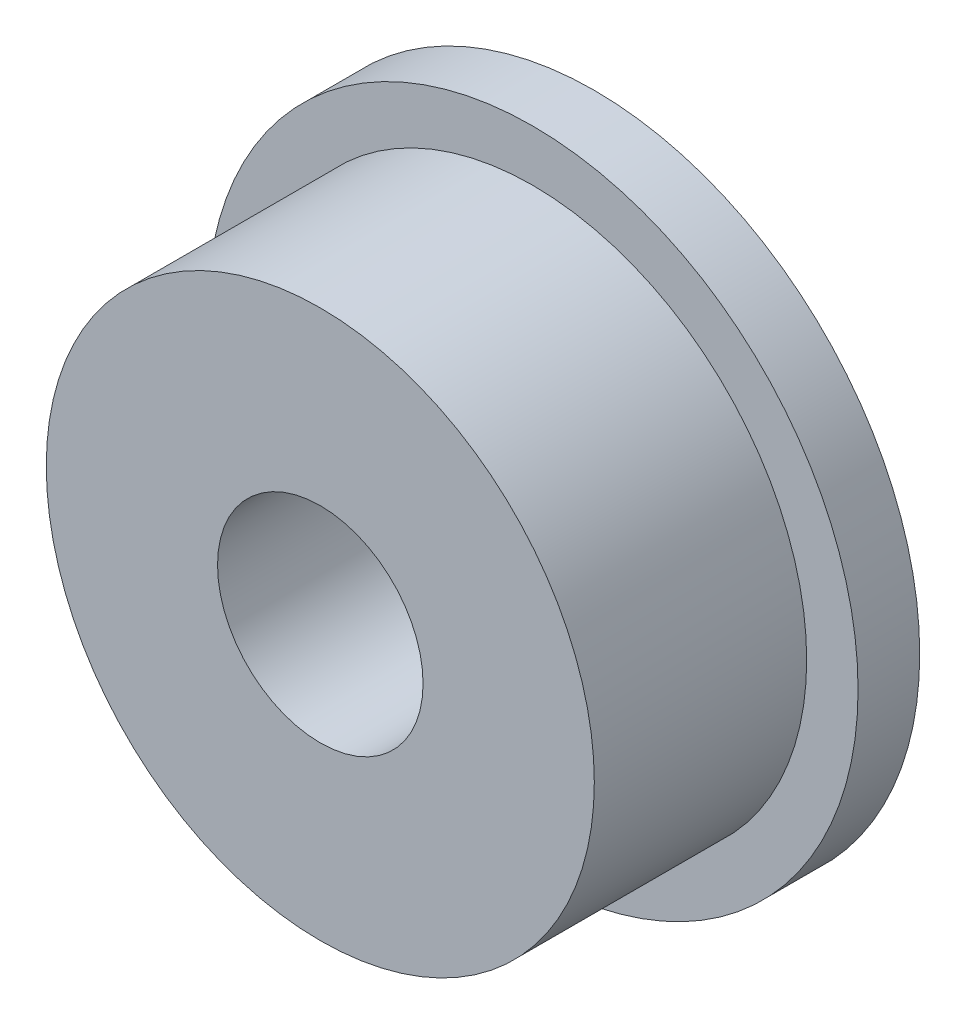
ISO-10303-21;
HEADER;
FILE_DESCRIPTION(('STEP AP214'),'2;1');
FILE_NAME('part.step','',(''),(''),'','','');
FILE_SCHEMA(('AUTOMOTIVE_DESIGN { 1 0 10303 214 1 1 1 1 }'));
ENDSEC;
DATA;
#1=APPLICATION_CONTEXT('core data for automotive mechanical design processes');
#2=APPLICATION_PROTOCOL_DEFINITION('international standard','automotive_design',2000,#1);
#3=PRODUCT_CONTEXT('',#1,'mechanical');
#4=PRODUCT('Part','Part','',(#3));
#5=PRODUCT_RELATED_PRODUCT_CATEGORY('part','',(#4));
#6=PRODUCT_DEFINITION_FORMATION('','',#4);
#7=PRODUCT_DEFINITION_CONTEXT('part definition',#1,'design');
#8=PRODUCT_DEFINITION('design','',#6,#7);
#9=PRODUCT_DEFINITION_SHAPE('','',#8);
#10=(LENGTH_UNIT() NAMED_UNIT(*) SI_UNIT(.MILLI.,.METRE.));
#11=(NAMED_UNIT(*) PLANE_ANGLE_UNIT() SI_UNIT($,.RADIAN.));
#12=(NAMED_UNIT(*) SI_UNIT($,.STERADIAN.) SOLID_ANGLE_UNIT());
#13=UNCERTAINTY_MEASURE_WITH_UNIT(LENGTH_MEASURE(1.E-05),#10,'distance_accuracy_value','');
#14=(GEOMETRIC_REPRESENTATION_CONTEXT(3) GLOBAL_UNCERTAINTY_ASSIGNED_CONTEXT((#13)) GLOBAL_UNIT_ASSIGNED_CONTEXT((#10,
#11,#12)) REPRESENTATION_CONTEXT('',''));
#15=CARTESIAN_POINT('',(0.,0.,0.));
#16=DIRECTION('',(0.,0.,1.));
#17=DIRECTION('',(1.,0.,0.));
#18=AXIS2_PLACEMENT_3D('',#15,#16,#17);
#19=CARTESIAN_POINT('',(0.,0.,6.5));
#20=DIRECTION('',(0.,0.,1.));
#21=DIRECTION('',(1.,0.,0.));
#22=AXIS2_PLACEMENT_3D('',#19,#20,#21);
#23=PLANE('',#22);
#24=CARTESIAN_POINT('',(0.,0.,6.5));
#25=DIRECTION('',(0.,0.,1.));
#26=DIRECTION('',(1.,0.,0.));
#27=AXIS2_PLACEMENT_3D('',#24,#25,#26);
#28=CIRCLE('',#27,4.);
#29=CARTESIAN_POINT('',(4.,0.,6.5));
#30=VERTEX_POINT('',#29);
#31=EDGE_CURVE('E10',#30,#30,#28,.T.);
#32=ORIENTED_EDGE('',*,*,#31,.T.);
#33=EDGE_LOOP('',(#32));
#34=FACE_BOUND('',#33,.T.);
#35=CARTESIAN_POINT('',(0.,0.,6.5));
#36=DIRECTION('',(0.,0.,1.));
#37=DIRECTION('',(1.,0.,0.));
#38=AXIS2_PLACEMENT_3D('',#35,#36,#37);
#39=CIRCLE('',#38,1.5);
#40=CARTESIAN_POINT('',(1.5,0.,6.5));
#41=VERTEX_POINT('',#40);
#42=EDGE_CURVE('E46',#41,#41,#39,.T.);
#43=ORIENTED_EDGE('',*,*,#42,.F.);
#44=EDGE_LOOP('',(#43));
#45=FACE_BOUND('',#44,.T.);
#46=ADVANCED_FACE('F39',(#34,#45),#23,.T.);
#47=CARTESIAN_POINT('',(0.,0.,2.5));
#48=DIRECTION('',(0.,0.,1.));
#49=DIRECTION('',(1.,0.,0.));
#50=AXIS2_PLACEMENT_3D('',#47,#48,#49);
#51=PLANE('',#50);
#52=CARTESIAN_POINT('',(0.,0.,2.5));
#53=DIRECTION('',(0.,0.,1.));
#54=DIRECTION('',(1.,0.,0.));
#55=AXIS2_PLACEMENT_3D('',#52,#53,#54);
#56=CIRCLE('',#55,1.5);
#57=CARTESIAN_POINT('',(1.5,0.,2.5));
#58=VERTEX_POINT('',#57);
#59=EDGE_CURVE('E49',#58,#58,#56,.T.);
#60=ORIENTED_EDGE('',*,*,#59,.T.);
#61=EDGE_LOOP('',(#60));
#62=FACE_BOUND('',#61,.T.);
#63=CARTESIAN_POINT('',(0.,0.,2.5));
#64=DIRECTION('',(0.,0.,1.));
#65=DIRECTION('',(1.,0.,0.));
#66=AXIS2_PLACEMENT_3D('',#63,#64,#65);
#67=CIRCLE('',#66,4.75);
#68=CARTESIAN_POINT('',(4.75,0.,2.5));
#69=VERTEX_POINT('',#68);
#70=EDGE_CURVE('E58',#69,#69,#67,.T.);
#71=ORIENTED_EDGE('',*,*,#70,.F.);
#72=EDGE_LOOP('',(#71));
#73=FACE_BOUND('',#72,.T.);
#74=ADVANCED_FACE('F73',(#62,#73),#51,.F.);
#75=CARTESIAN_POINT('',(0.,0.,6.5));
#76=DIRECTION('',(0.,0.,-1.));
#77=DIRECTION('',(-1.,0.,0.));
#78=AXIS2_PLACEMENT_3D('',#75,#76,#77);
#79=CYLINDRICAL_SURFACE('',#78,4.);
#80=CARTESIAN_POINT('',(0.,0.,3.4));
#81=DIRECTION('',(0.,0.,1.));
#82=DIRECTION('',(1.,0.,0.));
#83=AXIS2_PLACEMENT_3D('',#80,#81,#82);
#84=CIRCLE('',#83,4.);
#85=CARTESIAN_POINT('',(4.,0.,3.4));
#86=VERTEX_POINT('',#85);
#87=EDGE_CURVE('E54',#86,#86,#84,.T.);
#88=ORIENTED_EDGE('',*,*,#87,.T.);
#89=EDGE_LOOP('',(#88));
#90=FACE_BOUND('',#89,.T.);
#91=ORIENTED_EDGE('',*,*,#31,.F.);
#92=EDGE_LOOP('',(#91));
#93=FACE_BOUND('',#92,.T.);
#94=ADVANCED_FACE('F41',(#90,#93),#79,.T.);
#95=CARTESIAN_POINT('',(0.,0.,6.5));
#96=DIRECTION('',(0.,0.,-1.));
#97=DIRECTION('',(-1.,0.,0.));
#98=AXIS2_PLACEMENT_3D('',#95,#96,#97);
#99=CYLINDRICAL_SURFACE('',#98,1.5);
#100=ORIENTED_EDGE('',*,*,#42,.T.);
#101=EDGE_LOOP('',(#100));
#102=FACE_BOUND('',#101,.T.);
#103=ORIENTED_EDGE('',*,*,#59,.F.);
#104=EDGE_LOOP('',(#103));
#105=FACE_BOUND('',#104,.T.);
#106=ADVANCED_FACE('F85',(#102,#105),#99,.F.);
#107=CARTESIAN_POINT('',(0.,0.,3.4));
#108=DIRECTION('',(0.,0.,1.));
#109=DIRECTION('',(1.,0.,0.));
#110=AXIS2_PLACEMENT_3D('',#107,#108,#109);
#111=PLANE('',#110);
#112=CARTESIAN_POINT('',(0.,0.,3.4));
#113=DIRECTION('',(0.,0.,1.));
#114=DIRECTION('',(1.,0.,0.));
#115=AXIS2_PLACEMENT_3D('',#112,#113,#114);
#116=CIRCLE('',#115,4.75);
#117=CARTESIAN_POINT('',(4.75,0.,3.4));
#118=VERTEX_POINT('',#117);
#119=EDGE_CURVE('E56',#118,#118,#116,.T.);
#120=ORIENTED_EDGE('',*,*,#119,.T.);
#121=EDGE_LOOP('',(#120));
#122=FACE_BOUND('',#121,.T.);
#123=ORIENTED_EDGE('',*,*,#87,.F.);
#124=EDGE_LOOP('',(#123));
#125=FACE_BOUND('',#124,.T.);
#126=ADVANCED_FACE('F68',(#122,#125),#111,.T.);
#127=CARTESIAN_POINT('',(0.,0.,3.4));
#128=DIRECTION('',(0.,0.,-1.));
#129=DIRECTION('',(-1.,0.,0.));
#130=AXIS2_PLACEMENT_3D('',#127,#128,#129);
#131=CYLINDRICAL_SURFACE('',#130,4.75);
#132=ORIENTED_EDGE('',*,*,#119,.F.);
#133=EDGE_LOOP('',(#132));
#134=FACE_BOUND('',#133,.T.);
#135=ORIENTED_EDGE('',*,*,#70,.T.);
#136=EDGE_LOOP('',(#135));
#137=FACE_BOUND('',#136,.T.);
#138=ADVANCED_FACE('F69',(#134,#137),#131,.T.);
#139=CLOSED_SHELL('',(#46,#74,#94,#106,#126,#138));
#140=MANIFOLD_SOLID_BREP('B2',#139);
#141=ADVANCED_BREP_SHAPE_REPRESENTATION('',(#18,#140),#14);
#142=SHAPE_DEFINITION_REPRESENTATION(#9,#141);
ENDSEC;
END-ISO-10303-21;
